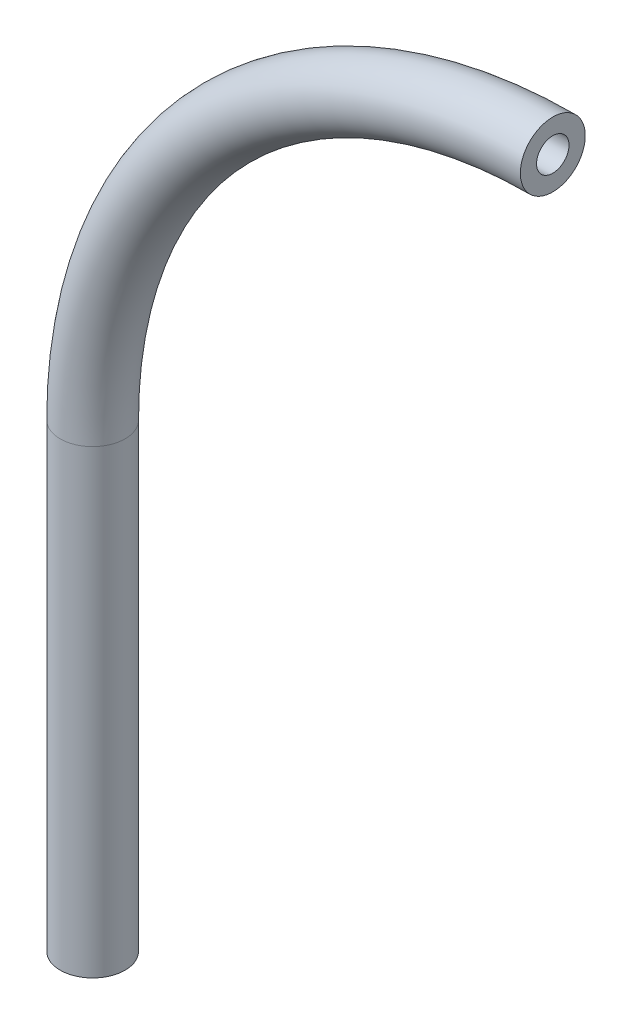
ISO-10303-21;
HEADER;
FILE_DESCRIPTION(('STEP AP214'),'2;1');
FILE_NAME('part.step','',(''),(''),'','','');
FILE_SCHEMA(('AUTOMOTIVE_DESIGN { 1 0 10303 214 1 1 1 1 }'));
ENDSEC;
DATA;
#1=APPLICATION_CONTEXT('core data for automotive mechanical design processes');
#2=APPLICATION_PROTOCOL_DEFINITION('international standard','automotive_design',2000,#1);
#3=PRODUCT_CONTEXT('',#1,'mechanical');
#4=PRODUCT('Part','Part','',(#3));
#5=PRODUCT_RELATED_PRODUCT_CATEGORY('part','',(#4));
#6=PRODUCT_DEFINITION_FORMATION('','',#4);
#7=PRODUCT_DEFINITION_CONTEXT('part definition',#1,'design');
#8=PRODUCT_DEFINITION('design','',#6,#7);
#9=PRODUCT_DEFINITION_SHAPE('','',#8);
#10=(LENGTH_UNIT() NAMED_UNIT(*) SI_UNIT(.MILLI.,.METRE.));
#11=(NAMED_UNIT(*) PLANE_ANGLE_UNIT() SI_UNIT($,.RADIAN.));
#12=(NAMED_UNIT(*) SI_UNIT($,.STERADIAN.) SOLID_ANGLE_UNIT());
#13=UNCERTAINTY_MEASURE_WITH_UNIT(LENGTH_MEASURE(1.E-05),#10,'distance_accuracy_value','');
#14=(GEOMETRIC_REPRESENTATION_CONTEXT(3) GLOBAL_UNCERTAINTY_ASSIGNED_CONTEXT((#13)) GLOBAL_UNIT_ASSIGNED_CONTEXT((#10,
#11,#12)) REPRESENTATION_CONTEXT('',''));
#15=CARTESIAN_POINT('',(0.,0.,0.));
#16=DIRECTION('',(0.,0.,1.));
#17=DIRECTION('',(1.,0.,0.));
#18=AXIS2_PLACEMENT_3D('',#15,#16,#17);
#19=CARTESIAN_POINT('',(45.,0.,0.));
#20=DIRECTION('',(0.,0.,1.));
#21=DIRECTION('',(1.,0.,0.));
#22=AXIS2_PLACEMENT_3D('',#19,#20,#21);
#23=TOROIDAL_SURFACE('',#22,45.,1.5875);
#24=CARTESIAN_POINT('',(45.,45.,0.));
#25=DIRECTION('',(1.,0.,0.));
#26=DIRECTION('',(0.,0.,1.));
#27=AXIS2_PLACEMENT_3D('',#24,#25,#26);
#28=CIRCLE('',#27,1.5875);
#29=CARTESIAN_POINT('',(45.,46.5875,0.));
#30=VERTEX_POINT('',#29);
#31=EDGE_CURVE('E38',#30,#30,#28,.T.);
#32=CARTESIAN_POINT('',(0.,0.,0.));
#33=DIRECTION('',(0.,1.,0.));
#34=DIRECTION('',(0.,0.,1.));
#35=AXIS2_PLACEMENT_3D('',#32,#33,#34);
#36=CIRCLE('',#35,1.5875);
#37=CARTESIAN_POINT('',(-1.58749999999999,0.,0.));
#38=VERTEX_POINT('',#37);
#39=EDGE_CURVE('E42',#38,#38,#36,.T.);
#40=CARTESIAN_POINT('',(45.,0.,0.));
#41=DIRECTION('',(0.,0.,1.));
#42=DIRECTION('',(1.,0.,0.));
#43=AXIS2_PLACEMENT_3D('',#40,#41,#42);
#44=CIRCLE('',#43,46.5875);
#45=EDGE_CURVE('',#30,#38,#44,.T.);
#46=ORIENTED_EDGE('',*,*,#31,.T.);
#47=ORIENTED_EDGE('',*,*,#39,.F.);
#48=ORIENTED_EDGE('',*,*,#45,.T.);
#49=ORIENTED_EDGE('',*,*,#45,.F.);
#50=EDGE_LOOP('',(#46,#48,#47,#49));
#51=FACE_BOUND('',#50,.T.);
#52=ADVANCED_FACE('F31',(#51),#23,.F.);
#53=CARTESIAN_POINT('',(45.,0.,0.));
#54=DIRECTION('',(0.,0.,1.));
#55=DIRECTION('',(1.,0.,0.));
#56=AXIS2_PLACEMENT_3D('',#53,#54,#55);
#57=TOROIDAL_SURFACE('',#56,45.,3.175);
#58=CARTESIAN_POINT('',(45.,45.,0.));
#59=DIRECTION('',(1.,0.,0.));
#60=DIRECTION('',(0.,0.,1.));
#61=AXIS2_PLACEMENT_3D('',#58,#59,#60);
#62=CIRCLE('',#61,3.175);
#63=CARTESIAN_POINT('',(45.,48.175,0.));
#64=VERTEX_POINT('',#63);
#65=EDGE_CURVE('E10',#64,#64,#62,.T.);
#66=CARTESIAN_POINT('',(0.,0.,0.));
#67=DIRECTION('',(0.,-1.,0.));
#68=DIRECTION('',(0.,0.,-1.));
#69=AXIS2_PLACEMENT_3D('',#66,#67,#68);
#70=CIRCLE('',#69,3.175);
#71=CARTESIAN_POINT('',(-3.175,0.,0.));
#72=VERTEX_POINT('',#71);
#73=EDGE_CURVE('E49',#72,#72,#70,.T.);
#74=CARTESIAN_POINT('',(45.,0.,0.));
#75=DIRECTION('',(0.,0.,1.));
#76=DIRECTION('',(1.,0.,0.));
#77=AXIS2_PLACEMENT_3D('',#74,#75,#76);
#78=CIRCLE('',#77,48.175);
#79=EDGE_CURVE('',#64,#72,#78,.T.);
#80=ORIENTED_EDGE('',*,*,#65,.F.);
#81=ORIENTED_EDGE('',*,*,#73,.F.);
#82=ORIENTED_EDGE('',*,*,#79,.T.);
#83=ORIENTED_EDGE('',*,*,#79,.F.);
#84=EDGE_LOOP('',(#80,#82,#81,#83));
#85=FACE_BOUND('',#84,.T.);
#86=ADVANCED_FACE('F33',(#85),#57,.T.);
#87=CARTESIAN_POINT('',(45.,45.,0.));
#88=DIRECTION('',(1.,0.,0.));
#89=DIRECTION('',(0.,0.,1.));
#90=AXIS2_PLACEMENT_3D('',#87,#88,#89);
#91=PLANE('',#90);
#92=ORIENTED_EDGE('',*,*,#31,.F.);
#93=EDGE_LOOP('',(#92));
#94=FACE_BOUND('',#93,.T.);
#95=ORIENTED_EDGE('',*,*,#65,.T.);
#96=EDGE_LOOP('',(#95));
#97=FACE_BOUND('',#96,.T.);
#98=ADVANCED_FACE('F64',(#94,#97),#91,.T.);
#99=CARTESIAN_POINT('',(0.,-45.,0.));
#100=DIRECTION('',(0.,-1.,0.));
#101=DIRECTION('',(0.,0.,-1.));
#102=AXIS2_PLACEMENT_3D('',#99,#100,#101);
#103=PLANE('',#102);
#104=CARTESIAN_POINT('',(0.,-45.,0.));
#105=DIRECTION('',(0.,-1.,0.));
#106=DIRECTION('',(0.,0.,-1.));
#107=AXIS2_PLACEMENT_3D('',#104,#105,#106);
#108=CIRCLE('',#107,3.175);
#109=CARTESIAN_POINT('',(0.,-45.,-3.175));
#110=VERTEX_POINT('',#109);
#111=EDGE_CURVE('E46',#110,#110,#108,.T.);
#112=ORIENTED_EDGE('',*,*,#111,.T.);
#113=EDGE_LOOP('',(#112));
#114=FACE_BOUND('',#113,.T.);
#115=CARTESIAN_POINT('',(0.,-45.,0.));
#116=DIRECTION('',(0.,-1.,0.));
#117=DIRECTION('',(0.,0.,-1.));
#118=AXIS2_PLACEMENT_3D('',#115,#116,#117);
#119=CIRCLE('',#118,1.5875);
#120=CARTESIAN_POINT('',(0.,-45.,-1.5875));
#121=VERTEX_POINT('',#120);
#122=EDGE_CURVE('E52',#121,#121,#119,.T.);
#123=ORIENTED_EDGE('',*,*,#122,.F.);
#124=EDGE_LOOP('',(#123));
#125=FACE_BOUND('',#124,.T.);
#126=ADVANCED_FACE('F61',(#114,#125),#103,.T.);
#127=CARTESIAN_POINT('',(0.,-45.,0.));
#128=DIRECTION('',(0.,1.,0.));
#129=DIRECTION('',(0.,0.,1.));
#130=AXIS2_PLACEMENT_3D('',#127,#128,#129);
#131=CYLINDRICAL_SURFACE('',#130,3.175);
#132=ORIENTED_EDGE('',*,*,#111,.F.);
#133=EDGE_LOOP('',(#132));
#134=FACE_BOUND('',#133,.T.);
#135=ORIENTED_EDGE('',*,*,#73,.T.);
#136=EDGE_LOOP('',(#135));
#137=FACE_BOUND('',#136,.T.);
#138=ADVANCED_FACE('F63',(#134,#137),#131,.T.);
#139=CARTESIAN_POINT('',(0.,-45.,0.));
#140=DIRECTION('',(0.,1.,0.));
#141=DIRECTION('',(0.,0.,1.));
#142=AXIS2_PLACEMENT_3D('',#139,#140,#141);
#143=CYLINDRICAL_SURFACE('',#142,1.5875);
#144=ORIENTED_EDGE('',*,*,#122,.T.);
#145=EDGE_LOOP('',(#144));
#146=FACE_BOUND('',#145,.T.);
#147=ORIENTED_EDGE('',*,*,#39,.T.);
#148=EDGE_LOOP('',(#147));
#149=FACE_BOUND('',#148,.T.);
#150=ADVANCED_FACE('F58',(#146,#149),#143,.F.);
#151=CLOSED_SHELL('',(#52,#86,#98,#126,#138,#150));
#152=MANIFOLD_SOLID_BREP('B2',#151);
#153=ADVANCED_BREP_SHAPE_REPRESENTATION('',(#18,#152),#14);
#154=SHAPE_DEFINITION_REPRESENTATION(#9,#153);
ENDSEC;
END-ISO-10303-21;
